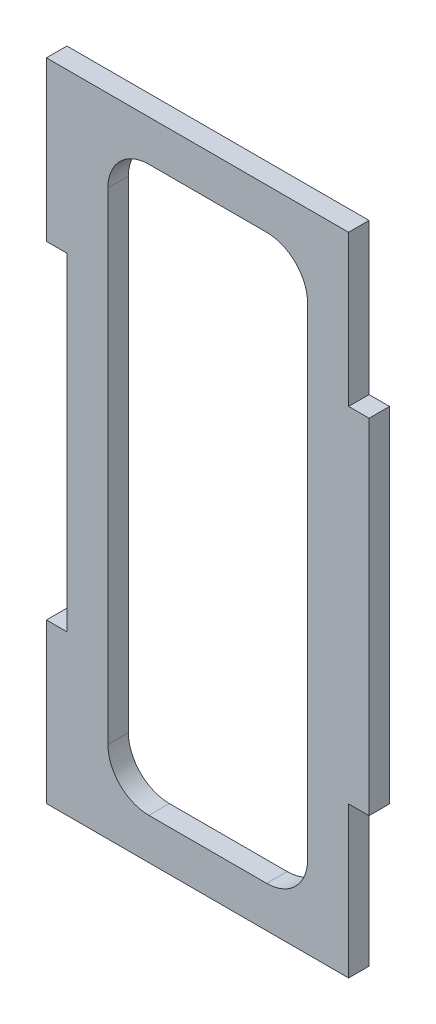
ISO-10303-21;
HEADER;
FILE_DESCRIPTION(('STEP AP214'),'2;1');
FILE_NAME('part.step','',(''),(''),'','','');
FILE_SCHEMA(('AUTOMOTIVE_DESIGN { 1 0 10303 214 1 1 1 1 }'));
ENDSEC;
DATA;
#1=APPLICATION_CONTEXT('core data for automotive mechanical design processes');
#2=APPLICATION_PROTOCOL_DEFINITION('international standard','automotive_design',2000,#1);
#3=PRODUCT_CONTEXT('',#1,'mechanical');
#4=PRODUCT('Part','Part','',(#3));
#5=PRODUCT_RELATED_PRODUCT_CATEGORY('part','',(#4));
#6=PRODUCT_DEFINITION_FORMATION('','',#4);
#7=PRODUCT_DEFINITION_CONTEXT('part definition',#1,'design');
#8=PRODUCT_DEFINITION('design','',#6,#7);
#9=PRODUCT_DEFINITION_SHAPE('','',#8);
#10=(LENGTH_UNIT() NAMED_UNIT(*) SI_UNIT(.MILLI.,.METRE.));
#11=(NAMED_UNIT(*) PLANE_ANGLE_UNIT() SI_UNIT($,.RADIAN.));
#12=(NAMED_UNIT(*) SI_UNIT($,.STERADIAN.) SOLID_ANGLE_UNIT());
#13=UNCERTAINTY_MEASURE_WITH_UNIT(LENGTH_MEASURE(1.E-05),#10,'distance_accuracy_value','');
#14=(GEOMETRIC_REPRESENTATION_CONTEXT(3) GLOBAL_UNCERTAINTY_ASSIGNED_CONTEXT((#13)) GLOBAL_UNIT_ASSIGNED_CONTEXT((#10,
#11,#12)) REPRESENTATION_CONTEXT('',''));
#15=CARTESIAN_POINT('',(0.,0.,0.));
#16=DIRECTION('',(0.,0.,1.));
#17=DIRECTION('',(1.,0.,0.));
#18=AXIS2_PLACEMENT_3D('',#15,#16,#17);
#19=CARTESIAN_POINT('',(43.65,0.,0.));
#20=DIRECTION('',(1.,0.,0.));
#21=DIRECTION('',(0.,0.,-1.));
#22=AXIS2_PLACEMENT_3D('',#19,#20,#21);
#23=PLANE('',#22);
#24=DIRECTION('',(0.,1.,0.));
#25=VECTOR('',#24,1.);
#26=CARTESIAN_POINT('',(43.65,0.,0.));
#27=LINE('',#26,#25);
#28=CARTESIAN_POINT('',(43.65,-150.1518,0.));
#29=VERTEX_POINT('',#28);
#30=CARTESIAN_POINT('',(43.65,-103.4159,0.));
#31=VERTEX_POINT('',#30);
#32=EDGE_CURVE('E227',#29,#31,#27,.T.);
#33=ORIENTED_EDGE('',*,*,#32,.T.);
#34=DIRECTION('',(0.,0.,-1.));
#35=VECTOR('',#34,1.);
#36=CARTESIAN_POINT('',(43.65,-103.4159,6.35));
#37=LINE('',#36,#35);
#38=CARTESIAN_POINT('',(43.65,-103.4159,6.35));
#39=VERTEX_POINT('',#38);
#40=EDGE_CURVE('E187',#39,#31,#37,.T.);
#41=ORIENTED_EDGE('',*,*,#40,.F.);
#42=DIRECTION('',(0.,1.,0.));
#43=VECTOR('',#42,1.);
#44=CARTESIAN_POINT('',(43.65,0.,6.35));
#45=LINE('',#44,#43);
#46=CARTESIAN_POINT('',(43.65,-150.1518,6.35));
#47=VERTEX_POINT('',#46);
#48=EDGE_CURVE('E186',#47,#39,#45,.T.);
#49=ORIENTED_EDGE('',*,*,#48,.F.);
#50=DIRECTION('',(0.,0.,1.));
#51=VECTOR('',#50,1.);
#52=CARTESIAN_POINT('',(43.65,-150.1518,0.));
#53=LINE('',#52,#51);
#54=EDGE_CURVE('E230',#29,#47,#53,.T.);
#55=ORIENTED_EDGE('',*,*,#54,.F.);
#56=EDGE_LOOP('',(#33,#41,#49,#55));
#57=FACE_BOUND('',#56,.T.);
#58=ADVANCED_FACE('F33',(#57),#23,.T.);
#59=CARTESIAN_POINT('',(0.,0.,6.35));
#60=DIRECTION('',(0.,0.,-1.));
#61=DIRECTION('',(-1.,0.,0.));
#62=AXIS2_PLACEMENT_3D('',#59,#60,#61);
#63=PLANE('',#62);
#64=DIRECTION('',(-1.,0.,0.));
#65=VECTOR('',#64,1.);
#66=CARTESIAN_POINT('',(50.,-103.4159,6.35));
#67=LINE('',#66,#65);
#68=CARTESIAN_POINT('',(50.,-103.4159,6.35));
#69=VERTEX_POINT('',#68);
#70=EDGE_CURVE('E48',#69,#39,#67,.T.);
#71=ORIENTED_EDGE('',*,*,#70,.F.);
#72=DIRECTION('',(0.,1.,0.));
#73=VECTOR('',#72,1.);
#74=CARTESIAN_POINT('',(50.,-150.1518,6.35));
#75=LINE('',#74,#73);
#76=CARTESIAN_POINT('',(50.,3.2641,6.35));
#77=VERTEX_POINT('',#76);
#78=EDGE_CURVE('E172',#69,#77,#75,.T.);
#79=ORIENTED_EDGE('',*,*,#78,.T.);
#80=DIRECTION('',(1.,0.,0.));
#81=VECTOR('',#80,1.);
#82=CARTESIAN_POINT('',(43.65,3.2641,6.35));
#83=LINE('',#82,#81);
#84=CARTESIAN_POINT('',(43.65,3.2641,6.35));
#85=VERTEX_POINT('',#84);
#86=EDGE_CURVE('E200',#85,#77,#83,.T.);
#87=ORIENTED_EDGE('',*,*,#86,.F.);
#88=DIRECTION('',(0.,-1.,0.));
#89=VECTOR('',#88,1.);
#90=CARTESIAN_POINT('',(43.65,0.,6.35));
#91=LINE('',#90,#89);
#92=CARTESIAN_POINT('',(43.65,50.,6.35));
#93=VERTEX_POINT('',#92);
#94=EDGE_CURVE('E234',#93,#85,#91,.T.);
#95=ORIENTED_EDGE('',*,*,#94,.F.);
#96=DIRECTION('',(-1.,0.,0.));
#97=VECTOR('',#96,1.);
#98=CARTESIAN_POINT('',(-50.,50.,6.35));
#99=LINE('',#98,#97);
#100=CARTESIAN_POINT('',(-50.,50.,6.35));
#101=VERTEX_POINT('',#100);
#102=EDGE_CURVE('E179',#93,#101,#99,.T.);
#103=ORIENTED_EDGE('',*,*,#102,.T.);
#104=DIRECTION('',(0.,-1.,0.));
#105=VECTOR('',#104,1.);
#106=CARTESIAN_POINT('',(-50.,-150.1518,6.35));
#107=LINE('',#106,#105);
#108=CARTESIAN_POINT('',(-50.,0.724100000000005,6.35));
#109=VERTEX_POINT('',#108);
#110=EDGE_CURVE('E269',#101,#109,#107,.T.);
#111=ORIENTED_EDGE('',*,*,#110,.T.);
#112=DIRECTION('',(1.,0.,0.));
#113=VECTOR('',#112,1.);
#114=CARTESIAN_POINT('',(0.,0.724100000000005,6.35));
#115=LINE('',#114,#113);
#116=CARTESIAN_POINT('',(-43.65,0.724100000000005,6.35));
#117=VERTEX_POINT('',#116);
#118=EDGE_CURVE('E247',#109,#117,#115,.T.);
#119=ORIENTED_EDGE('',*,*,#118,.T.);
#120=DIRECTION('',(0.,1.,0.));
#121=VECTOR('',#120,1.);
#122=CARTESIAN_POINT('',(-43.65,0.,6.35));
#123=LINE('',#122,#121);
#124=CARTESIAN_POINT('',(-43.65,-100.8759,6.35));
#125=VERTEX_POINT('',#124);
#126=EDGE_CURVE('E255',#125,#117,#123,.T.);
#127=ORIENTED_EDGE('',*,*,#126,.F.);
#128=DIRECTION('',(1.,0.,0.));
#129=VECTOR('',#128,1.);
#130=CARTESIAN_POINT('',(0.,-100.8759,6.35));
#131=LINE('',#130,#129);
#132=CARTESIAN_POINT('',(-50.,-100.8759,6.35));
#133=VERTEX_POINT('',#132);
#134=EDGE_CURVE('E242',#133,#125,#131,.T.);
#135=ORIENTED_EDGE('',*,*,#134,.F.);
#136=CARTESIAN_POINT('',(-50.,-150.1518,6.35));
#137=VERTEX_POINT('',#136);
#138=EDGE_CURVE('E272',#133,#137,#107,.T.);
#139=ORIENTED_EDGE('',*,*,#138,.T.);
#140=DIRECTION('',(1.,0.,0.));
#141=VECTOR('',#140,1.);
#142=CARTESIAN_POINT('',(-50.,-150.1518,6.35));
#143=LINE('',#142,#141);
#144=EDGE_CURVE('E180',#137,#47,#143,.T.);
#145=ORIENTED_EDGE('',*,*,#144,.T.);
#146=ORIENTED_EDGE('',*,*,#48,.T.);
#147=EDGE_LOOP('',(#71,#79,#87,#95,#103,#111,#119,#127,#135,#139,#145,#146));
#148=FACE_BOUND('',#147,.T.);
#149=DIRECTION('',(1.,0.,0.));
#150=VECTOR('',#149,1.);
#151=CARTESIAN_POINT('',(-30.95,-137.4518,6.35));
#152=LINE('',#151,#150);
#153=CARTESIAN_POINT('',(-18.25,-137.4518,6.35));
#154=VERTEX_POINT('',#153);
#155=CARTESIAN_POINT('',(18.25,-137.4518,6.35));
#156=VERTEX_POINT('',#155);
#157=EDGE_CURVE('E219',#154,#156,#152,.T.);
#158=ORIENTED_EDGE('',*,*,#157,.F.);
#159=CARTESIAN_POINT('',(-18.25,-124.7518,6.35));
#160=DIRECTION('',(0.,0.,-1.));
#161=DIRECTION('',(-1.,0.,0.));
#162=AXIS2_PLACEMENT_3D('',#159,#160,#161);
#163=CIRCLE('',#162,12.7);
#164=CARTESIAN_POINT('',(-30.95,-124.7518,6.35));
#165=VERTEX_POINT('',#164);
#166=EDGE_CURVE('E41',#154,#165,#163,.T.);
#167=ORIENTED_EDGE('',*,*,#166,.T.);
#168=DIRECTION('',(0.,-1.,0.));
#169=VECTOR('',#168,1.);
#170=CARTESIAN_POINT('',(-30.95,-137.4518,6.35));
#171=LINE('',#170,#169);
#172=CARTESIAN_POINT('',(-30.95,24.6,6.35));
#173=VERTEX_POINT('',#172);
#174=EDGE_CURVE('E205',#173,#165,#171,.T.);
#175=ORIENTED_EDGE('',*,*,#174,.F.);
#176=CARTESIAN_POINT('',(-18.25,24.6,6.35));
#177=DIRECTION('',(0.,0.,-1.));
#178=DIRECTION('',(-1.,0.,0.));
#179=AXIS2_PLACEMENT_3D('',#176,#177,#178);
#180=CIRCLE('',#179,12.7);
#181=CARTESIAN_POINT('',(-18.25,37.3,6.35));
#182=VERTEX_POINT('',#181);
#183=EDGE_CURVE('E318',#173,#182,#180,.T.);
#184=ORIENTED_EDGE('',*,*,#183,.T.);
#185=DIRECTION('',(-1.,0.,0.));
#186=VECTOR('',#185,1.);
#187=CARTESIAN_POINT('',(-30.95,37.3,6.35));
#188=LINE('',#187,#186);
#189=CARTESIAN_POINT('',(18.25,37.3,6.35));
#190=VERTEX_POINT('',#189);
#191=EDGE_CURVE('E209',#190,#182,#188,.T.);
#192=ORIENTED_EDGE('',*,*,#191,.F.);
#193=CARTESIAN_POINT('',(18.25,24.6,6.35));
#194=DIRECTION('',(0.,0.,-1.));
#195=DIRECTION('',(-1.,0.,0.));
#196=AXIS2_PLACEMENT_3D('',#193,#194,#195);
#197=CIRCLE('',#196,12.7);
#198=CARTESIAN_POINT('',(30.9499999999999,24.6,6.35));
#199=VERTEX_POINT('',#198);
#200=EDGE_CURVE('E314',#190,#199,#197,.T.);
#201=ORIENTED_EDGE('',*,*,#200,.T.);
#202=DIRECTION('',(0.,1.,0.));
#203=VECTOR('',#202,1.);
#204=CARTESIAN_POINT('',(30.9499999999999,-137.4518,6.35));
#205=LINE('',#204,#203);
#206=CARTESIAN_POINT('',(30.9499999999999,-124.7518,6.35));
#207=VERTEX_POINT('',#206);
#208=EDGE_CURVE('E222',#207,#199,#205,.T.);
#209=ORIENTED_EDGE('',*,*,#208,.F.);
#210=CARTESIAN_POINT('',(18.25,-124.7518,6.35));
#211=DIRECTION('',(0.,0.,-1.));
#212=DIRECTION('',(-1.,0.,0.));
#213=AXIS2_PLACEMENT_3D('',#210,#211,#212);
#214=CIRCLE('',#213,12.7);
#215=EDGE_CURVE('E310',#207,#156,#214,.T.);
#216=ORIENTED_EDGE('',*,*,#215,.T.);
#217=EDGE_LOOP('',(#158,#167,#175,#184,#192,#201,#209,#216));
#218=FACE_BOUND('',#217,.T.);
#219=ADVANCED_FACE('F183',(#148,#218),#63,.F.);
#220=CARTESIAN_POINT('',(0.,0.,0.));
#221=DIRECTION('',(0.,0.,-1.));
#222=DIRECTION('',(-1.,0.,0.));
#223=AXIS2_PLACEMENT_3D('',#220,#221,#222);
#224=PLANE('',#223);
#225=DIRECTION('',(0.,1.,0.));
#226=VECTOR('',#225,1.);
#227=CARTESIAN_POINT('',(50.,-150.1518,0.));
#228=LINE('',#227,#226);
#229=CARTESIAN_POINT('',(50.,-103.4159,0.));
#230=VERTEX_POINT('',#229);
#231=CARTESIAN_POINT('',(50.,3.2641,0.));
#232=VERTEX_POINT('',#231);
#233=EDGE_CURVE('E282',#230,#232,#228,.T.);
#234=ORIENTED_EDGE('',*,*,#233,.F.);
#235=DIRECTION('',(1.,0.,0.));
#236=VECTOR('',#235,1.);
#237=CARTESIAN_POINT('',(50.,-103.4159,0.));
#238=LINE('',#237,#236);
#239=EDGE_CURVE('E192',#31,#230,#238,.T.);
#240=ORIENTED_EDGE('',*,*,#239,.F.);
#241=ORIENTED_EDGE('',*,*,#32,.F.);
#242=DIRECTION('',(1.,0.,0.));
#243=VECTOR('',#242,1.);
#244=CARTESIAN_POINT('',(-50.,-150.1518,0.));
#245=LINE('',#244,#243);
#246=CARTESIAN_POINT('',(-50.,-150.1518,0.));
#247=VERTEX_POINT('',#246);
#248=EDGE_CURVE('E279',#247,#29,#245,.T.);
#249=ORIENTED_EDGE('',*,*,#248,.F.);
#250=DIRECTION('',(0.,-1.,0.));
#251=VECTOR('',#250,1.);
#252=CARTESIAN_POINT('',(-50.,-150.1518,0.));
#253=LINE('',#252,#251);
#254=CARTESIAN_POINT('',(-50.,-100.8759,0.));
#255=VERTEX_POINT('',#254);
#256=EDGE_CURVE('E263',#255,#247,#253,.T.);
#257=ORIENTED_EDGE('',*,*,#256,.F.);
#258=DIRECTION('',(1.,0.,0.));
#259=VECTOR('',#258,1.);
#260=CARTESIAN_POINT('',(0.,-100.8759,0.));
#261=LINE('',#260,#259);
#262=CARTESIAN_POINT('',(-43.65,-100.8759,0.));
#263=VERTEX_POINT('',#262);
#264=EDGE_CURVE('E243',#255,#263,#261,.T.);
#265=ORIENTED_EDGE('',*,*,#264,.T.);
#266=DIRECTION('',(0.,1.,0.));
#267=VECTOR('',#266,1.);
#268=CARTESIAN_POINT('',(-43.65,0.,0.));
#269=LINE('',#268,#267);
#270=CARTESIAN_POINT('',(-43.65,0.724100000000005,0.));
#271=VERTEX_POINT('',#270);
#272=EDGE_CURVE('E246',#263,#271,#269,.T.);
#273=ORIENTED_EDGE('',*,*,#272,.T.);
#274=DIRECTION('',(1.,0.,0.));
#275=VECTOR('',#274,1.);
#276=CARTESIAN_POINT('',(0.,0.724100000000005,0.));
#277=LINE('',#276,#275);
#278=CARTESIAN_POINT('',(-50.,0.724100000000005,0.));
#279=VERTEX_POINT('',#278);
#280=EDGE_CURVE('E250',#279,#271,#277,.T.);
#281=ORIENTED_EDGE('',*,*,#280,.F.);
#282=CARTESIAN_POINT('',(-50.,50.,0.));
#283=VERTEX_POINT('',#282);
#284=EDGE_CURVE('E276',#283,#279,#253,.T.);
#285=ORIENTED_EDGE('',*,*,#284,.F.);
#286=DIRECTION('',(-1.,0.,0.));
#287=VECTOR('',#286,1.);
#288=CARTESIAN_POINT('',(-50.,50.,0.));
#289=LINE('',#288,#287);
#290=CARTESIAN_POINT('',(43.65,50.,0.));
#291=VERTEX_POINT('',#290);
#292=EDGE_CURVE('E284',#291,#283,#289,.T.);
#293=ORIENTED_EDGE('',*,*,#292,.F.);
#294=DIRECTION('',(0.,-1.,0.));
#295=VECTOR('',#294,1.);
#296=CARTESIAN_POINT('',(43.65,0.,0.));
#297=LINE('',#296,#295);
#298=CARTESIAN_POINT('',(43.65,3.2641,0.));
#299=VERTEX_POINT('',#298);
#300=EDGE_CURVE('E235',#291,#299,#297,.T.);
#301=ORIENTED_EDGE('',*,*,#300,.T.);
#302=DIRECTION('',(-1.,0.,0.));
#303=VECTOR('',#302,1.);
#304=CARTESIAN_POINT('',(43.65,3.2641,0.));
#305=LINE('',#304,#303);
#306=EDGE_CURVE('E203',#232,#299,#305,.T.);
#307=ORIENTED_EDGE('',*,*,#306,.F.);
#308=EDGE_LOOP('',(#234,#240,#241,#249,#257,#265,#273,#281,#285,#293,#301,#307));
#309=FACE_BOUND('',#308,.T.);
#310=DIRECTION('',(-1.,0.,0.));
#311=VECTOR('',#310,1.);
#312=CARTESIAN_POINT('',(-30.95,37.3,0.));
#313=LINE('',#312,#311);
#314=CARTESIAN_POINT('',(18.25,37.3,0.));
#315=VERTEX_POINT('',#314);
#316=CARTESIAN_POINT('',(-18.25,37.3,0.));
#317=VERTEX_POINT('',#316);
#318=EDGE_CURVE('E215',#315,#317,#313,.T.);
#319=ORIENTED_EDGE('',*,*,#318,.T.);
#320=CARTESIAN_POINT('',(-18.25,24.6,0.));
#321=DIRECTION('',(0.,0.,-1.));
#322=DIRECTION('',(-1.,0.,0.));
#323=AXIS2_PLACEMENT_3D('',#320,#321,#322);
#324=CIRCLE('',#323,12.7);
#325=CARTESIAN_POINT('',(-30.95,24.6,0.));
#326=VERTEX_POINT('',#325);
#327=EDGE_CURVE('E320',#317,#326,#324,.F.);
#328=ORIENTED_EDGE('',*,*,#327,.T.);
#329=DIRECTION('',(0.,-1.,0.));
#330=VECTOR('',#329,1.);
#331=CARTESIAN_POINT('',(-30.95,-137.4518,0.));
#332=LINE('',#331,#330);
#333=CARTESIAN_POINT('',(-30.95,-124.7518,0.));
#334=VERTEX_POINT('',#333);
#335=EDGE_CURVE('E206',#326,#334,#332,.T.);
#336=ORIENTED_EDGE('',*,*,#335,.T.);
#337=CARTESIAN_POINT('',(-18.25,-124.7518,0.));
#338=DIRECTION('',(0.,0.,-1.));
#339=DIRECTION('',(-1.,0.,0.));
#340=AXIS2_PLACEMENT_3D('',#337,#338,#339);
#341=CIRCLE('',#340,12.7);
#342=CARTESIAN_POINT('',(-18.25,-137.4518,0.));
#343=VERTEX_POINT('',#342);
#344=EDGE_CURVE('E11',#334,#343,#341,.F.);
#345=ORIENTED_EDGE('',*,*,#344,.T.);
#346=DIRECTION('',(1.,0.,0.));
#347=VECTOR('',#346,1.);
#348=CARTESIAN_POINT('',(-30.95,-137.4518,0.));
#349=LINE('',#348,#347);
#350=CARTESIAN_POINT('',(18.25,-137.4518,0.));
#351=VERTEX_POINT('',#350);
#352=EDGE_CURVE('E208',#343,#351,#349,.T.);
#353=ORIENTED_EDGE('',*,*,#352,.T.);
#354=CARTESIAN_POINT('',(18.25,-124.7518,0.));
#355=DIRECTION('',(0.,0.,-1.));
#356=DIRECTION('',(-1.,0.,0.));
#357=AXIS2_PLACEMENT_3D('',#354,#355,#356);
#358=CIRCLE('',#357,12.7);
#359=CARTESIAN_POINT('',(30.9499999999999,-124.7518,0.));
#360=VERTEX_POINT('',#359);
#361=EDGE_CURVE('E312',#351,#360,#358,.F.);
#362=ORIENTED_EDGE('',*,*,#361,.T.);
#363=DIRECTION('',(0.,1.,0.));
#364=VECTOR('',#363,1.);
#365=CARTESIAN_POINT('',(30.9499999999999,-137.4518,0.));
#366=LINE('',#365,#364);
#367=CARTESIAN_POINT('',(30.9499999999999,24.6,0.));
#368=VERTEX_POINT('',#367);
#369=EDGE_CURVE('E212',#360,#368,#366,.T.);
#370=ORIENTED_EDGE('',*,*,#369,.T.);
#371=CARTESIAN_POINT('',(18.25,24.6,0.));
#372=DIRECTION('',(0.,0.,-1.));
#373=DIRECTION('',(-1.,0.,0.));
#374=AXIS2_PLACEMENT_3D('',#371,#372,#373);
#375=CIRCLE('',#374,12.7);
#376=EDGE_CURVE('E316',#368,#315,#375,.F.);
#377=ORIENTED_EDGE('',*,*,#376,.T.);
#378=EDGE_LOOP('',(#319,#328,#336,#345,#353,#362,#370,#377));
#379=FACE_BOUND('',#378,.T.);
#380=ADVANCED_FACE('F330',(#309,#379),#224,.T.);
#381=CARTESIAN_POINT('',(-50.,-150.1518,6.35));
#382=DIRECTION('',(0.,1.,0.));
#383=DIRECTION('',(0.,0.,1.));
#384=AXIS2_PLACEMENT_3D('',#381,#382,#383);
#385=PLANE('',#384);
#386=ORIENTED_EDGE('',*,*,#54,.T.);
#387=ORIENTED_EDGE('',*,*,#144,.F.);
#388=DIRECTION('',(0.,0.,-1.));
#389=VECTOR('',#388,1.);
#390=CARTESIAN_POINT('',(-50.,-150.1518,6.35));
#391=LINE('',#390,#389);
#392=EDGE_CURVE('E288',#137,#247,#391,.T.);
#393=ORIENTED_EDGE('',*,*,#392,.T.);
#394=ORIENTED_EDGE('',*,*,#248,.T.);
#395=EDGE_LOOP('',(#386,#387,#393,#394));
#396=FACE_BOUND('',#395,.T.);
#397=ADVANCED_FACE('F393',(#396),#385,.F.);
#398=CARTESIAN_POINT('',(50.,-150.1518,6.35));
#399=DIRECTION('',(-1.,0.,0.));
#400=DIRECTION('',(0.,0.,1.));
#401=AXIS2_PLACEMENT_3D('',#398,#399,#400);
#402=PLANE('',#401);
#403=ORIENTED_EDGE('',*,*,#78,.F.);
#404=DIRECTION('',(0.,0.,1.));
#405=VECTOR('',#404,1.);
#406=CARTESIAN_POINT('',(50.,-103.4159,6.35));
#407=LINE('',#406,#405);
#408=EDGE_CURVE('E174',#230,#69,#407,.T.);
#409=ORIENTED_EDGE('',*,*,#408,.F.);
#410=ORIENTED_EDGE('',*,*,#233,.T.);
#411=DIRECTION('',(0.,0.,-1.));
#412=VECTOR('',#411,1.);
#413=CARTESIAN_POINT('',(50.,3.2641,0.));
#414=LINE('',#413,#412);
#415=EDGE_CURVE('E176',#77,#232,#414,.T.);
#416=ORIENTED_EDGE('',*,*,#415,.F.);
#417=EDGE_LOOP('',(#403,#409,#410,#416));
#418=FACE_BOUND('',#417,.T.);
#419=ADVANCED_FACE('F173',(#418),#402,.F.);
#420=CARTESIAN_POINT('',(-50.,-150.1518,6.35));
#421=DIRECTION('',(1.,0.,0.));
#422=DIRECTION('',(0.,0.,-1.));
#423=AXIS2_PLACEMENT_3D('',#420,#421,#422);
#424=PLANE('',#423);
#425=DIRECTION('',(0.,0.,1.));
#426=VECTOR('',#425,1.);
#427=CARTESIAN_POINT('',(-50.,0.724100000000005,0.));
#428=LINE('',#427,#426);
#429=EDGE_CURVE('E260',#279,#109,#428,.T.);
#430=ORIENTED_EDGE('',*,*,#429,.T.);
#431=ORIENTED_EDGE('',*,*,#110,.F.);
#432=DIRECTION('',(0.,0.,-1.));
#433=VECTOR('',#432,1.);
#434=CARTESIAN_POINT('',(-50.,50.,6.35));
#435=LINE('',#434,#433);
#436=EDGE_CURVE('E275',#101,#283,#435,.T.);
#437=ORIENTED_EDGE('',*,*,#436,.T.);
#438=ORIENTED_EDGE('',*,*,#284,.T.);
#439=EDGE_LOOP('',(#430,#431,#437,#438));
#440=FACE_BOUND('',#439,.T.);
#441=ADVANCED_FACE('F401',(#440),#424,.F.);
#442=ORIENTED_EDGE('',*,*,#138,.F.);
#443=DIRECTION('',(0.,0.,1.));
#444=VECTOR('',#443,1.);
#445=CARTESIAN_POINT('',(-50.,-100.8759,0.));
#446=LINE('',#445,#444);
#447=EDGE_CURVE('E252',#255,#133,#446,.T.);
#448=ORIENTED_EDGE('',*,*,#447,.F.);
#449=ORIENTED_EDGE('',*,*,#256,.T.);
#450=ORIENTED_EDGE('',*,*,#392,.F.);
#451=EDGE_LOOP('',(#442,#448,#449,#450));
#452=FACE_BOUND('',#451,.T.);
#453=ADVANCED_FACE('F397',(#452),#424,.F.);
#454=CARTESIAN_POINT('',(-50.,50.,6.35));
#455=DIRECTION('',(0.,-1.,0.));
#456=DIRECTION('',(0.,0.,-1.));
#457=AXIS2_PLACEMENT_3D('',#454,#455,#456);
#458=PLANE('',#457);
#459=ORIENTED_EDGE('',*,*,#102,.F.);
#460=DIRECTION('',(0.,0.,1.));
#461=VECTOR('',#460,1.);
#462=CARTESIAN_POINT('',(43.65,50.,0.));
#463=LINE('',#462,#461);
#464=EDGE_CURVE('E238',#291,#93,#463,.T.);
#465=ORIENTED_EDGE('',*,*,#464,.F.);
#466=ORIENTED_EDGE('',*,*,#292,.T.);
#467=ORIENTED_EDGE('',*,*,#436,.F.);
#468=EDGE_LOOP('',(#459,#465,#466,#467));
#469=FACE_BOUND('',#468,.T.);
#470=ADVANCED_FACE('F383',(#469),#458,.F.);
#471=CARTESIAN_POINT('',(0.,0.724100000000005,0.));
#472=DIRECTION('',(0.,-1.,0.));
#473=DIRECTION('',(0.,0.,-1.));
#474=AXIS2_PLACEMENT_3D('',#471,#472,#473);
#475=PLANE('',#474);
#476=ORIENTED_EDGE('',*,*,#118,.F.);
#477=ORIENTED_EDGE('',*,*,#429,.F.);
#478=ORIENTED_EDGE('',*,*,#280,.T.);
#479=DIRECTION('',(0.,0.,1.));
#480=VECTOR('',#479,1.);
#481=CARTESIAN_POINT('',(-43.65,0.724100000000005,0.));
#482=LINE('',#481,#480);
#483=EDGE_CURVE('E264',#271,#117,#482,.T.);
#484=ORIENTED_EDGE('',*,*,#483,.T.);
#485=EDGE_LOOP('',(#476,#477,#478,#484));
#486=FACE_BOUND('',#485,.T.);
#487=ADVANCED_FACE('F379',(#486),#475,.T.);
#488=CARTESIAN_POINT('',(-43.65,0.,0.));
#489=DIRECTION('',(1.,0.,0.));
#490=DIRECTION('',(0.,0.,-1.));
#491=AXIS2_PLACEMENT_3D('',#488,#489,#490);
#492=PLANE('',#491);
#493=ORIENTED_EDGE('',*,*,#126,.T.);
#494=ORIENTED_EDGE('',*,*,#483,.F.);
#495=ORIENTED_EDGE('',*,*,#272,.F.);
#496=DIRECTION('',(0.,0.,1.));
#497=VECTOR('',#496,1.);
#498=CARTESIAN_POINT('',(-43.65,-100.8759,0.));
#499=LINE('',#498,#497);
#500=EDGE_CURVE('E266',#263,#125,#499,.T.);
#501=ORIENTED_EDGE('',*,*,#500,.T.);
#502=EDGE_LOOP('',(#493,#494,#495,#501));
#503=FACE_BOUND('',#502,.T.);
#504=ADVANCED_FACE('F382',(#503),#492,.F.);
#505=CARTESIAN_POINT('',(0.,-100.8759,0.));
#506=DIRECTION('',(0.,-1.,0.));
#507=DIRECTION('',(0.,0.,-1.));
#508=AXIS2_PLACEMENT_3D('',#505,#506,#507);
#509=PLANE('',#508);
#510=ORIENTED_EDGE('',*,*,#134,.T.);
#511=ORIENTED_EDGE('',*,*,#500,.F.);
#512=ORIENTED_EDGE('',*,*,#264,.F.);
#513=ORIENTED_EDGE('',*,*,#447,.T.);
#514=EDGE_LOOP('',(#510,#511,#512,#513));
#515=FACE_BOUND('',#514,.T.);
#516=ADVANCED_FACE('F377',(#515),#509,.F.);
#517=CARTESIAN_POINT('',(43.65,0.,0.));
#518=DIRECTION('',(-1.,0.,0.));
#519=DIRECTION('',(0.,-1.,0.));
#520=AXIS2_PLACEMENT_3D('',#517,#518,#519);
#521=PLANE('',#520);
#522=ORIENTED_EDGE('',*,*,#94,.T.);
#523=DIRECTION('',(0.,0.,1.));
#524=VECTOR('',#523,1.);
#525=CARTESIAN_POINT('',(43.65,3.2641,0.));
#526=LINE('',#525,#524);
#527=EDGE_CURVE('E197',#299,#85,#526,.T.);
#528=ORIENTED_EDGE('',*,*,#527,.F.);
#529=ORIENTED_EDGE('',*,*,#300,.F.);
#530=ORIENTED_EDGE('',*,*,#464,.T.);
#531=EDGE_LOOP('',(#522,#528,#529,#530));
#532=FACE_BOUND('',#531,.T.);
#533=ADVANCED_FACE('F374',(#532),#521,.F.);
#534=CARTESIAN_POINT('',(-30.95,-137.4518,0.));
#535=DIRECTION('',(-1.,0.,0.));
#536=DIRECTION('',(0.,0.,1.));
#537=AXIS2_PLACEMENT_3D('',#534,#535,#536);
#538=PLANE('',#537);
#539=ORIENTED_EDGE('',*,*,#335,.F.);
#540=DIRECTION('',(0.,0.,1.));
#541=VECTOR('',#540,1.);
#542=CARTESIAN_POINT('',(-30.95,24.6,6.35));
#543=LINE('',#542,#541);
#544=EDGE_CURVE('E307',#326,#173,#543,.T.);
#545=ORIENTED_EDGE('',*,*,#544,.T.);
#546=ORIENTED_EDGE('',*,*,#174,.T.);
#547=DIRECTION('',(0.,0.,1.));
#548=VECTOR('',#547,1.);
#549=CARTESIAN_POINT('',(-30.95,-124.7518,0.));
#550=LINE('',#549,#548);
#551=EDGE_CURVE('E56',#165,#334,#550,.F.);
#552=ORIENTED_EDGE('',*,*,#551,.T.);
#553=EDGE_LOOP('',(#539,#545,#546,#552));
#554=FACE_BOUND('',#553,.T.);
#555=ADVANCED_FACE('F325',(#554),#538,.F.);
#556=CARTESIAN_POINT('',(-30.95,37.3,0.));
#557=DIRECTION('',(0.,1.,0.));
#558=DIRECTION('',(0.,0.,1.));
#559=AXIS2_PLACEMENT_3D('',#556,#557,#558);
#560=PLANE('',#559);
#561=ORIENTED_EDGE('',*,*,#318,.F.);
#562=DIRECTION('',(0.,0.,1.));
#563=VECTOR('',#562,1.);
#564=CARTESIAN_POINT('',(18.25,37.3,6.35));
#565=LINE('',#564,#563);
#566=EDGE_CURVE('E303',#315,#190,#565,.T.);
#567=ORIENTED_EDGE('',*,*,#566,.T.);
#568=ORIENTED_EDGE('',*,*,#191,.T.);
#569=DIRECTION('',(0.,0.,1.));
#570=VECTOR('',#569,1.);
#571=CARTESIAN_POINT('',(-18.25,37.3,0.));
#572=LINE('',#571,#570);
#573=EDGE_CURVE('E301',#182,#317,#572,.F.);
#574=ORIENTED_EDGE('',*,*,#573,.T.);
#575=EDGE_LOOP('',(#561,#567,#568,#574));
#576=FACE_BOUND('',#575,.T.);
#577=ADVANCED_FACE('F350',(#576),#560,.F.);
#578=CARTESIAN_POINT('',(30.9499999999999,-137.4518,0.));
#579=DIRECTION('',(1.,0.,0.));
#580=DIRECTION('',(0.,0.,-1.));
#581=AXIS2_PLACEMENT_3D('',#578,#579,#580);
#582=PLANE('',#581);
#583=ORIENTED_EDGE('',*,*,#369,.F.);
#584=DIRECTION('',(0.,0.,1.));
#585=VECTOR('',#584,1.);
#586=CARTESIAN_POINT('',(30.9499999999999,-124.7518,6.35));
#587=LINE('',#586,#585);
#588=EDGE_CURVE('E293',#360,#207,#587,.T.);
#589=ORIENTED_EDGE('',*,*,#588,.T.);
#590=ORIENTED_EDGE('',*,*,#208,.T.);
#591=DIRECTION('',(0.,0.,1.));
#592=VECTOR('',#591,1.);
#593=CARTESIAN_POINT('',(30.9499999999999,24.6,0.));
#594=LINE('',#593,#592);
#595=EDGE_CURVE('E291',#199,#368,#594,.F.);
#596=ORIENTED_EDGE('',*,*,#595,.T.);
#597=EDGE_LOOP('',(#583,#589,#590,#596));
#598=FACE_BOUND('',#597,.T.);
#599=ADVANCED_FACE('F341',(#598),#582,.F.);
#600=CARTESIAN_POINT('',(-30.95,-137.4518,0.));
#601=DIRECTION('',(0.,-1.,0.));
#602=DIRECTION('',(0.,0.,-1.));
#603=AXIS2_PLACEMENT_3D('',#600,#601,#602);
#604=PLANE('',#603);
#605=ORIENTED_EDGE('',*,*,#157,.T.);
#606=DIRECTION('',(0.,0.,1.));
#607=VECTOR('',#606,1.);
#608=CARTESIAN_POINT('',(18.25,-137.4518,0.));
#609=LINE('',#608,#607);
#610=EDGE_CURVE('E299',#156,#351,#609,.F.);
#611=ORIENTED_EDGE('',*,*,#610,.T.);
#612=ORIENTED_EDGE('',*,*,#352,.F.);
#613=DIRECTION('',(0.,0.,1.));
#614=VECTOR('',#613,1.);
#615=CARTESIAN_POINT('',(-18.25,-137.4518,6.35));
#616=LINE('',#615,#614);
#617=EDGE_CURVE('E296',#343,#154,#616,.T.);
#618=ORIENTED_EDGE('',*,*,#617,.T.);
#619=EDGE_LOOP('',(#605,#611,#612,#618));
#620=FACE_BOUND('',#619,.T.);
#621=ADVANCED_FACE('F333',(#620),#604,.F.);
#622=CARTESIAN_POINT('',(18.25,-124.7518,0.));
#623=DIRECTION('',(0.,0.,-1.));
#624=DIRECTION('',(-1.,0.,0.));
#625=AXIS2_PLACEMENT_3D('',#622,#623,#624);
#626=CYLINDRICAL_SURFACE('',#625,12.7);
#627=ORIENTED_EDGE('',*,*,#361,.F.);
#628=ORIENTED_EDGE('',*,*,#610,.F.);
#629=ORIENTED_EDGE('',*,*,#215,.F.);
#630=ORIENTED_EDGE('',*,*,#588,.F.);
#631=EDGE_LOOP('',(#627,#628,#629,#630));
#632=FACE_BOUND('',#631,.T.);
#633=ADVANCED_FACE('F336',(#632),#626,.F.);
#634=CARTESIAN_POINT('',(18.25,24.6,0.));
#635=DIRECTION('',(0.,0.,-1.));
#636=DIRECTION('',(-1.,0.,0.));
#637=AXIS2_PLACEMENT_3D('',#634,#635,#636);
#638=CYLINDRICAL_SURFACE('',#637,12.7);
#639=ORIENTED_EDGE('',*,*,#376,.F.);
#640=ORIENTED_EDGE('',*,*,#595,.F.);
#641=ORIENTED_EDGE('',*,*,#200,.F.);
#642=ORIENTED_EDGE('',*,*,#566,.F.);
#643=EDGE_LOOP('',(#639,#640,#641,#642));
#644=FACE_BOUND('',#643,.T.);
#645=ADVANCED_FACE('F345',(#644),#638,.F.);
#646=CARTESIAN_POINT('',(-18.25,24.6,0.));
#647=DIRECTION('',(0.,0.,-1.));
#648=DIRECTION('',(-1.,0.,0.));
#649=AXIS2_PLACEMENT_3D('',#646,#647,#648);
#650=CYLINDRICAL_SURFACE('',#649,12.7);
#651=ORIENTED_EDGE('',*,*,#327,.F.);
#652=ORIENTED_EDGE('',*,*,#573,.F.);
#653=ORIENTED_EDGE('',*,*,#183,.F.);
#654=ORIENTED_EDGE('',*,*,#544,.F.);
#655=EDGE_LOOP('',(#651,#652,#653,#654));
#656=FACE_BOUND('',#655,.T.);
#657=ADVANCED_FACE('F354',(#656),#650,.F.);
#658=CARTESIAN_POINT('',(-18.25,-124.7518,0.));
#659=DIRECTION('',(0.,0.,-1.));
#660=DIRECTION('',(-1.,0.,0.));
#661=AXIS2_PLACEMENT_3D('',#658,#659,#660);
#662=CYLINDRICAL_SURFACE('',#661,12.7);
#663=ORIENTED_EDGE('',*,*,#344,.F.);
#664=ORIENTED_EDGE('',*,*,#551,.F.);
#665=ORIENTED_EDGE('',*,*,#166,.F.);
#666=ORIENTED_EDGE('',*,*,#617,.F.);
#667=EDGE_LOOP('',(#663,#664,#665,#666));
#668=FACE_BOUND('',#667,.T.);
#669=ADVANCED_FACE('F35',(#668),#662,.F.);
#670=CARTESIAN_POINT('',(0.,3.2641,0.));
#671=DIRECTION('',(0.,1.,0.));
#672=DIRECTION('',(0.,0.,1.));
#673=AXIS2_PLACEMENT_3D('',#670,#671,#672);
#674=PLANE('',#673);
#675=ORIENTED_EDGE('',*,*,#527,.T.);
#676=ORIENTED_EDGE('',*,*,#86,.T.);
#677=ORIENTED_EDGE('',*,*,#415,.T.);
#678=ORIENTED_EDGE('',*,*,#306,.T.);
#679=EDGE_LOOP('',(#675,#676,#677,#678));
#680=FACE_BOUND('',#679,.T.);
#681=ADVANCED_FACE('F360',(#680),#674,.T.);
#682=CARTESIAN_POINT('',(0.,-103.4159,0.));
#683=DIRECTION('',(0.,1.,0.));
#684=DIRECTION('',(0.,0.,1.));
#685=AXIS2_PLACEMENT_3D('',#682,#683,#684);
#686=PLANE('',#685);
#687=ORIENTED_EDGE('',*,*,#408,.T.);
#688=ORIENTED_EDGE('',*,*,#70,.T.);
#689=ORIENTED_EDGE('',*,*,#40,.T.);
#690=ORIENTED_EDGE('',*,*,#239,.T.);
#691=EDGE_LOOP('',(#687,#688,#689,#690));
#692=FACE_BOUND('',#691,.T.);
#693=ADVANCED_FACE('F190',(#692),#686,.F.);
#694=CLOSED_SHELL('',(#58,#219,#380,#397,#419,#441,#453,#470,#487,#504,#516,#533,#555,#577,#599,
#621,#633,#645,#657,#669,#681,#693));
#695=MANIFOLD_SOLID_BREP('B2',#694);
#696=ADVANCED_BREP_SHAPE_REPRESENTATION('',(#18,#695),#14);
#697=SHAPE_DEFINITION_REPRESENTATION(#9,#696);
ENDSEC;
END-ISO-10303-21;
